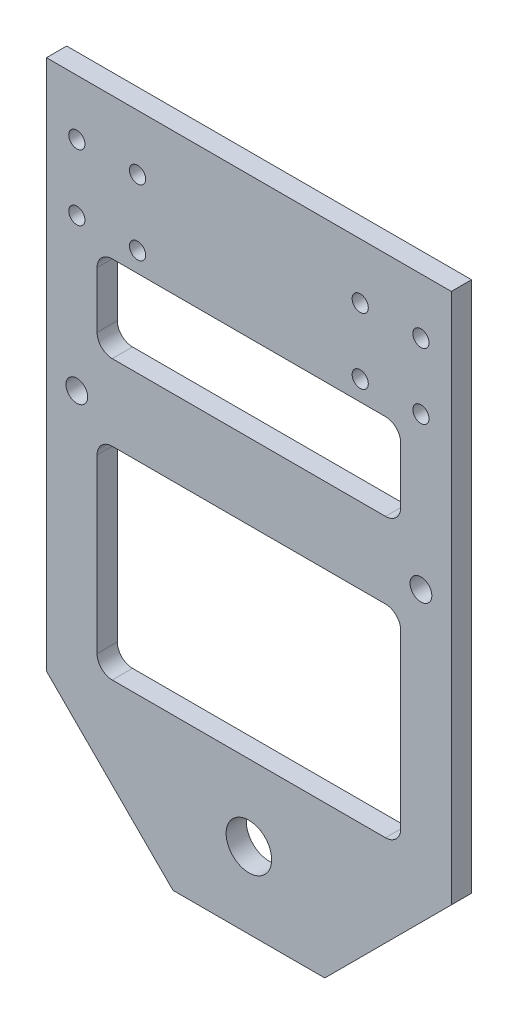
ISO-10303-21;
HEADER;
FILE_DESCRIPTION(('STEP AP214'),'2;1');
FILE_NAME('part.step','',(''),(''),'','','');
FILE_SCHEMA(('AUTOMOTIVE_DESIGN { 1 0 10303 214 1 1 1 1 }'));
ENDSEC;
DATA;
#1=APPLICATION_CONTEXT('core data for automotive mechanical design processes');
#2=APPLICATION_PROTOCOL_DEFINITION('international standard','automotive_design',2000,#1);
#3=PRODUCT_CONTEXT('',#1,'mechanical');
#4=PRODUCT('Part','Part','',(#3));
#5=PRODUCT_RELATED_PRODUCT_CATEGORY('part','',(#4));
#6=PRODUCT_DEFINITION_FORMATION('','',#4);
#7=PRODUCT_DEFINITION_CONTEXT('part definition',#1,'design');
#8=PRODUCT_DEFINITION('design','',#6,#7);
#9=PRODUCT_DEFINITION_SHAPE('','',#8);
#10=(LENGTH_UNIT() NAMED_UNIT(*) SI_UNIT(.MILLI.,.METRE.));
#11=(NAMED_UNIT(*) PLANE_ANGLE_UNIT() SI_UNIT($,.RADIAN.));
#12=(NAMED_UNIT(*) SI_UNIT($,.STERADIAN.) SOLID_ANGLE_UNIT());
#13=UNCERTAINTY_MEASURE_WITH_UNIT(LENGTH_MEASURE(1.E-05),#10,'distance_accuracy_value','');
#14=(GEOMETRIC_REPRESENTATION_CONTEXT(3) GLOBAL_UNCERTAINTY_ASSIGNED_CONTEXT((#13)) GLOBAL_UNIT_ASSIGNED_CONTEXT((#10,
#11,#12)) REPRESENTATION_CONTEXT('',''));
#15=CARTESIAN_POINT('',(0.,0.,0.));
#16=DIRECTION('',(0.,0.,1.));
#17=DIRECTION('',(1.,0.,0.));
#18=AXIS2_PLACEMENT_3D('',#15,#16,#17);
#19=CARTESIAN_POINT('',(0.,0.,-4.));
#20=DIRECTION('',(0.,0.,1.));
#21=DIRECTION('',(1.,0.,0.));
#22=AXIS2_PLACEMENT_3D('',#19,#20,#21);
#23=PLANE('',#22);
#24=CARTESIAN_POINT('',(-34.0000000000009,62.000000000002,-4.));
#25=DIRECTION('',(0.,0.,-1.));
#26=DIRECTION('',(-1.,0.,0.));
#27=AXIS2_PLACEMENT_3D('',#24,#25,#26);
#28=CIRCLE('',#27,1.5999999999986);
#29=CARTESIAN_POINT('',(-35.5999999999995,62.000000000002,-4.));
#30=VERTEX_POINT('',#29);
#31=EDGE_CURVE('E403',#30,#30,#28,.T.);
#32=ORIENTED_EDGE('',*,*,#31,.F.);
#33=EDGE_LOOP('',(#32));
#34=FACE_BOUND('',#33,.T.);
#35=CARTESIAN_POINT('',(34.,75.0000000000004,-4.));
#36=DIRECTION('',(0.,0.,-1.));
#37=DIRECTION('',(-1.,0.,0.));
#38=AXIS2_PLACEMENT_3D('',#35,#36,#37);
#39=CIRCLE('',#38,1.59999999992459);
#40=CARTESIAN_POINT('',(32.4000000000754,75.0000000000004,-4.));
#41=VERTEX_POINT('',#40);
#42=EDGE_CURVE('E410',#41,#41,#39,.T.);
#43=ORIENTED_EDGE('',*,*,#42,.F.);
#44=EDGE_LOOP('',(#43));
#45=FACE_BOUND('',#44,.T.);
#46=CARTESIAN_POINT('',(22.,75.0000000000004,-4.));
#47=DIRECTION('',(0.,0.,-1.));
#48=DIRECTION('',(-1.,0.,0.));
#49=AXIS2_PLACEMENT_3D('',#46,#47,#48);
#50=CIRCLE('',#49,1.59999999992459);
#51=CARTESIAN_POINT('',(20.4000000000754,75.0000000000004,-4.));
#52=VERTEX_POINT('',#51);
#53=EDGE_CURVE('E391',#52,#52,#50,.T.);
#54=ORIENTED_EDGE('',*,*,#53,.F.);
#55=EDGE_LOOP('',(#54));
#56=FACE_BOUND('',#55,.T.);
#57=CARTESIAN_POINT('',(-21.9999999999999,75.0000000000008,-4.));
#58=DIRECTION('',(0.,0.,-1.));
#59=DIRECTION('',(-1.,0.,0.));
#60=AXIS2_PLACEMENT_3D('',#57,#58,#59);
#61=CIRCLE('',#60,1.5999999999246);
#62=CARTESIAN_POINT('',(-23.5999999999245,75.0000000000008,-4.));
#63=VERTEX_POINT('',#62);
#64=EDGE_CURVE('E398',#63,#63,#61,.T.);
#65=ORIENTED_EDGE('',*,*,#64,.F.);
#66=EDGE_LOOP('',(#65));
#67=FACE_BOUND('',#66,.T.);
#68=CARTESIAN_POINT('',(-22.0000000000009,62.000000000002,-4.));
#69=DIRECTION('',(0.,0.,-1.));
#70=DIRECTION('',(-1.,0.,0.));
#71=AXIS2_PLACEMENT_3D('',#68,#69,#70);
#72=CIRCLE('',#71,1.59999999999762);
#73=CARTESIAN_POINT('',(-23.5999999999985,62.000000000002,-4.));
#74=VERTEX_POINT('',#73);
#75=EDGE_CURVE('E427',#74,#74,#72,.T.);
#76=ORIENTED_EDGE('',*,*,#75,.F.);
#77=EDGE_LOOP('',(#76));
#78=FACE_BOUND('',#77,.T.);
#79=CARTESIAN_POINT('',(21.9999999999999,62.0000000000022,-4.));
#80=DIRECTION('',(0.,0.,-1.));
#81=DIRECTION('',(-1.,0.,0.));
#82=AXIS2_PLACEMENT_3D('',#79,#80,#81);
#83=CIRCLE('',#82,1.60000000003217);
#84=CARTESIAN_POINT('',(20.3999999999678,62.0000000000022,-4.));
#85=VERTEX_POINT('',#84);
#86=EDGE_CURVE('E421',#85,#85,#83,.T.);
#87=ORIENTED_EDGE('',*,*,#86,.F.);
#88=EDGE_LOOP('',(#87));
#89=FACE_BOUND('',#88,.T.);
#90=CARTESIAN_POINT('',(33.9999999999999,62.0000000000022,-4.));
#91=DIRECTION('',(0.,0.,-1.));
#92=DIRECTION('',(-1.,0.,0.));
#93=AXIS2_PLACEMENT_3D('',#90,#91,#92);
#94=CIRCLE('',#93,1.60000000003218);
#95=CARTESIAN_POINT('',(32.3999999999678,62.0000000000022,-4.));
#96=VERTEX_POINT('',#95);
#97=EDGE_CURVE('E415',#96,#96,#94,.T.);
#98=ORIENTED_EDGE('',*,*,#97,.F.);
#99=EDGE_LOOP('',(#98));
#100=FACE_BOUND('',#99,.T.);
#101=CARTESIAN_POINT('',(-33.9999999999999,75.0000000000008,-4.));
#102=DIRECTION('',(0.,0.,-1.));
#103=DIRECTION('',(-1.,0.,0.));
#104=AXIS2_PLACEMENT_3D('',#101,#102,#103);
#105=CIRCLE('',#104,1.59999999992463);
#106=CARTESIAN_POINT('',(-35.5999999999245,75.0000000000008,-4.));
#107=VERTEX_POINT('',#106);
#108=EDGE_CURVE('E385',#107,#107,#105,.T.);
#109=ORIENTED_EDGE('',*,*,#108,.F.);
#110=EDGE_LOOP('',(#109));
#111=FACE_BOUND('',#110,.T.);
#112=CARTESIAN_POINT('',(34.,32.0000000000003,-4.));
#113=DIRECTION('',(0.,0.,-1.));
#114=DIRECTION('',(-1.,0.,0.));
#115=AXIS2_PLACEMENT_3D('',#112,#113,#114);
#116=CIRCLE('',#115,2.15);
#117=CARTESIAN_POINT('',(31.85,32.0000000000003,-4.));
#118=VERTEX_POINT('',#117);
#119=EDGE_CURVE('E380',#118,#118,#116,.T.);
#120=ORIENTED_EDGE('',*,*,#119,.F.);
#121=EDGE_LOOP('',(#120));
#122=FACE_BOUND('',#121,.T.);
#123=CARTESIAN_POINT('',(-34.,32.0000000000003,-4.));
#124=DIRECTION('',(0.,0.,-1.));
#125=DIRECTION('',(-1.,0.,0.));
#126=AXIS2_PLACEMENT_3D('',#123,#124,#125);
#127=CIRCLE('',#126,2.15);
#128=CARTESIAN_POINT('',(-36.15,32.0000000000003,-4.));
#129=VERTEX_POINT('',#128);
#130=EDGE_CURVE('E373',#129,#129,#127,.T.);
#131=ORIENTED_EDGE('',*,*,#130,.F.);
#132=EDGE_LOOP('',(#131));
#133=FACE_BOUND('',#132,.T.);
#134=DIRECTION('',(-1.,0.,0.));
#135=VECTOR('',#134,1.);
#136=CARTESIAN_POINT('',(0.,26.0000000000003,-4.));
#137=LINE('',#136,#135);
#138=CARTESIAN_POINT('',(27.,26.0000000000003,-4.));
#139=VERTEX_POINT('',#138);
#140=CARTESIAN_POINT('',(-27.,26.0000000000003,-4.));
#141=VERTEX_POINT('',#140);
#142=EDGE_CURVE('E59',#139,#141,#137,.T.);
#143=ORIENTED_EDGE('',*,*,#142,.T.);
#144=CARTESIAN_POINT('',(-27.,23.0000000000003,-4.));
#145=DIRECTION('',(0.,0.,-1.));
#146=DIRECTION('',(-1.,0.,0.));
#147=AXIS2_PLACEMENT_3D('',#144,#145,#146);
#148=CIRCLE('',#147,3.);
#149=CARTESIAN_POINT('',(-30.,23.0000000000003,-4.));
#150=VERTEX_POINT('',#149);
#151=EDGE_CURVE('E258',#141,#150,#148,.F.);
#152=ORIENTED_EDGE('',*,*,#151,.T.);
#153=DIRECTION('',(0.,-1.,0.));
#154=VECTOR('',#153,1.);
#155=CARTESIAN_POINT('',(-30.,0.,-4.));
#156=LINE('',#155,#154);
#157=CARTESIAN_POINT('',(-30.,-10.9999999999997,-4.));
#158=VERTEX_POINT('',#157);
#159=EDGE_CURVE('E255',#150,#158,#156,.T.);
#160=ORIENTED_EDGE('',*,*,#159,.T.);
#161=CARTESIAN_POINT('',(-27.,-10.9999999999997,-4.));
#162=DIRECTION('',(0.,0.,-1.));
#163=DIRECTION('',(-1.,0.,0.));
#164=AXIS2_PLACEMENT_3D('',#161,#162,#163);
#165=CIRCLE('',#164,3.);
#166=CARTESIAN_POINT('',(-27.,-13.9999999999997,-4.));
#167=VERTEX_POINT('',#166);
#168=EDGE_CURVE('E252',#167,#158,#165,.T.);
#169=ORIENTED_EDGE('',*,*,#168,.F.);
#170=DIRECTION('',(-1.,0.,0.));
#171=VECTOR('',#170,1.);
#172=CARTESIAN_POINT('',(0.,-13.9999999999997,-4.));
#173=LINE('',#172,#171);
#174=CARTESIAN_POINT('',(27.,-13.9999999999997,-4.));
#175=VERTEX_POINT('',#174);
#176=EDGE_CURVE('E249',#175,#167,#173,.T.);
#177=ORIENTED_EDGE('',*,*,#176,.F.);
#178=CARTESIAN_POINT('',(27.,-10.9999999999997,-4.));
#179=DIRECTION('',(0.,0.,-1.));
#180=DIRECTION('',(-1.,0.,0.));
#181=AXIS2_PLACEMENT_3D('',#178,#179,#180);
#182=CIRCLE('',#181,3.);
#183=CARTESIAN_POINT('',(30.,-10.9999999999997,-4.));
#184=VERTEX_POINT('',#183);
#185=EDGE_CURVE('E246',#184,#175,#182,.T.);
#186=ORIENTED_EDGE('',*,*,#185,.F.);
#187=DIRECTION('',(0.,-1.,0.));
#188=VECTOR('',#187,1.);
#189=CARTESIAN_POINT('',(30.,0.,-4.));
#190=LINE('',#189,#188);
#191=CARTESIAN_POINT('',(30.,23.0000000000003,-4.));
#192=VERTEX_POINT('',#191);
#193=EDGE_CURVE('E243',#192,#184,#190,.T.);
#194=ORIENTED_EDGE('',*,*,#193,.F.);
#195=CARTESIAN_POINT('',(27.,23.0000000000003,-4.));
#196=DIRECTION('',(0.,0.,-1.));
#197=DIRECTION('',(-1.,0.,0.));
#198=AXIS2_PLACEMENT_3D('',#195,#196,#197);
#199=CIRCLE('',#198,3.);
#200=EDGE_CURVE('E239',#139,#192,#199,.T.);
#201=ORIENTED_EDGE('',*,*,#200,.F.);
#202=EDGE_LOOP('',(#143,#152,#160,#169,#177,#186,#194,#201));
#203=FACE_BOUND('',#202,.T.);
#204=CARTESIAN_POINT('',(0.,-28.9999999999997,-4.));
#205=DIRECTION('',(0.,0.,1.));
#206=DIRECTION('',(1.,0.,0.));
#207=AXIS2_PLACEMENT_3D('',#204,#205,#206);
#208=CIRCLE('',#207,4.5);
#209=CARTESIAN_POINT('',(4.50000000000001,-28.9999999999997,-4.));
#210=VERTEX_POINT('',#209);
#211=EDGE_CURVE('E277',#210,#210,#208,.T.);
#212=ORIENTED_EDGE('',*,*,#211,.T.);
#213=EDGE_LOOP('',(#212));
#214=FACE_BOUND('',#213,.T.);
#215=DIRECTION('',(1.,0.,0.));
#216=VECTOR('',#215,1.);
#217=CARTESIAN_POINT('',(-40.,-43.9999999999997,-4.));
#218=LINE('',#217,#216);
#219=CARTESIAN_POINT('',(-14.9999999999999,-43.9999999999997,-4.));
#220=VERTEX_POINT('',#219);
#221=CARTESIAN_POINT('',(15.,-43.9999999999997,-4.));
#222=VERTEX_POINT('',#221);
#223=EDGE_CURVE('E286',#220,#222,#218,.T.);
#224=ORIENTED_EDGE('',*,*,#223,.F.);
#225=DIRECTION('',(0.707106781186549,-0.707106781186546,0.));
#226=VECTOR('',#225,1.);
#227=CARTESIAN_POINT('',(-40.,-18.9999999999997,-4.));
#228=LINE('',#227,#226);
#229=CARTESIAN_POINT('',(-40.,-18.9999999999997,-4.));
#230=VERTEX_POINT('',#229);
#231=EDGE_CURVE('E323',#220,#230,#228,.F.);
#232=ORIENTED_EDGE('',*,*,#231,.T.);
#233=DIRECTION('',(0.,-1.,0.));
#234=VECTOR('',#233,1.);
#235=CARTESIAN_POINT('',(-40.,86.0000000000003,-4.));
#236=LINE('',#235,#234);
#237=CARTESIAN_POINT('',(-40.,86.0000000000003,-4.));
#238=VERTEX_POINT('',#237);
#239=EDGE_CURVE('E283',#238,#230,#236,.T.);
#240=ORIENTED_EDGE('',*,*,#239,.F.);
#241=DIRECTION('',(-1.,0.,0.));
#242=VECTOR('',#241,1.);
#243=CARTESIAN_POINT('',(-40.,86.0000000000003,-4.));
#244=LINE('',#243,#242);
#245=CARTESIAN_POINT('',(40.,86.0000000000003,-4.));
#246=VERTEX_POINT('',#245);
#247=EDGE_CURVE('E292',#246,#238,#244,.T.);
#248=ORIENTED_EDGE('',*,*,#247,.F.);
#249=DIRECTION('',(0.,1.,0.));
#250=VECTOR('',#249,1.);
#251=CARTESIAN_POINT('',(40.,86.0000000000003,-4.));
#252=LINE('',#251,#250);
#253=CARTESIAN_POINT('',(40.,-18.9999999999996,-4.));
#254=VERTEX_POINT('',#253);
#255=EDGE_CURVE('E290',#254,#246,#252,.T.);
#256=ORIENTED_EDGE('',*,*,#255,.F.);
#257=DIRECTION('',(0.707106781186546,0.707106781186549,0.));
#258=VECTOR('',#257,1.);
#259=CARTESIAN_POINT('',(15.,-43.9999999999997,-4.));
#260=LINE('',#259,#258);
#261=EDGE_CURVE('E321',#254,#222,#260,.F.);
#262=ORIENTED_EDGE('',*,*,#261,.T.);
#263=EDGE_LOOP('',(#224,#232,#240,#248,#256,#262));
#264=FACE_BOUND('',#263,.T.);
#265=CARTESIAN_POINT('',(27.,55.0700000000003,-4.));
#266=DIRECTION('',(0.,0.,-1.));
#267=DIRECTION('',(-1.,0.,0.));
#268=AXIS2_PLACEMENT_3D('',#265,#266,#267);
#269=CIRCLE('',#268,3.);
#270=CARTESIAN_POINT('',(30.,55.0700000000003,-4.));
#271=VERTEX_POINT('',#270);
#272=CARTESIAN_POINT('',(27.,58.0700000000003,-4.));
#273=VERTEX_POINT('',#272);
#274=EDGE_CURVE('E51',#271,#273,#269,.F.);
#275=ORIENTED_EDGE('',*,*,#274,.T.);
#276=DIRECTION('',(-1.,0.,0.));
#277=VECTOR('',#276,1.);
#278=CARTESIAN_POINT('',(0.,58.0700000000003,-4.));
#279=LINE('',#278,#277);
#280=CARTESIAN_POINT('',(-27.,58.0700000000003,-4.));
#281=VERTEX_POINT('',#280);
#282=EDGE_CURVE('E222',#273,#281,#279,.T.);
#283=ORIENTED_EDGE('',*,*,#282,.T.);
#284=CARTESIAN_POINT('',(-27.,55.0700000000003,-4.));
#285=DIRECTION('',(0.,0.,-1.));
#286=DIRECTION('',(-1.,0.,0.));
#287=AXIS2_PLACEMENT_3D('',#284,#285,#286);
#288=CIRCLE('',#287,3.);
#289=CARTESIAN_POINT('',(-30.,55.0700000000003,-4.));
#290=VERTEX_POINT('',#289);
#291=EDGE_CURVE('E219',#290,#281,#288,.T.);
#292=ORIENTED_EDGE('',*,*,#291,.F.);
#293=DIRECTION('',(0.,-1.,0.));
#294=VECTOR('',#293,1.);
#295=CARTESIAN_POINT('',(-30.,0.,-4.));
#296=LINE('',#295,#294);
#297=CARTESIAN_POINT('',(-30.,44.0000000000003,-4.));
#298=VERTEX_POINT('',#297);
#299=EDGE_CURVE('E216',#290,#298,#296,.T.);
#300=ORIENTED_EDGE('',*,*,#299,.T.);
#301=CARTESIAN_POINT('',(-27.,44.0000000000003,-4.));
#302=DIRECTION('',(0.,0.,-1.));
#303=DIRECTION('',(-1.,0.,0.));
#304=AXIS2_PLACEMENT_3D('',#301,#302,#303);
#305=CIRCLE('',#304,3.);
#306=CARTESIAN_POINT('',(-27.,41.0000000000003,-4.));
#307=VERTEX_POINT('',#306);
#308=EDGE_CURVE('E210',#307,#298,#305,.T.);
#309=ORIENTED_EDGE('',*,*,#308,.F.);
#310=DIRECTION('',(-1.,0.,0.));
#311=VECTOR('',#310,1.);
#312=CARTESIAN_POINT('',(0.,41.0000000000003,-4.));
#313=LINE('',#312,#311);
#314=CARTESIAN_POINT('',(27.,41.0000000000003,-4.));
#315=VERTEX_POINT('',#314);
#316=EDGE_CURVE('E208',#315,#307,#313,.T.);
#317=ORIENTED_EDGE('',*,*,#316,.F.);
#318=CARTESIAN_POINT('',(27.,44.0000000000003,-4.));
#319=DIRECTION('',(0.,0.,-1.));
#320=DIRECTION('',(-1.,0.,0.));
#321=AXIS2_PLACEMENT_3D('',#318,#319,#320);
#322=CIRCLE('',#321,3.);
#323=CARTESIAN_POINT('',(30.,44.0000000000003,-4.));
#324=VERTEX_POINT('',#323);
#325=EDGE_CURVE('E192',#324,#315,#322,.T.);
#326=ORIENTED_EDGE('',*,*,#325,.F.);
#327=DIRECTION('',(0.,-1.,0.));
#328=VECTOR('',#327,1.);
#329=CARTESIAN_POINT('',(30.,0.,-4.));
#330=LINE('',#329,#328);
#331=EDGE_CURVE('E202',#271,#324,#330,.T.);
#332=ORIENTED_EDGE('',*,*,#331,.F.);
#333=EDGE_LOOP('',(#275,#283,#292,#300,#309,#317,#326,#332));
#334=FACE_BOUND('',#333,.T.);
#335=ADVANCED_FACE('F36',(#34,#45,#56,#67,#78,#89,#100,#111,#122,#133,#203,#214,#264,#334),#23,.F.);
#336=CARTESIAN_POINT('',(0.,0.,0.));
#337=DIRECTION('',(0.,0.,1.));
#338=DIRECTION('',(1.,0.,0.));
#339=AXIS2_PLACEMENT_3D('',#336,#337,#338);
#340=PLANE('',#339);
#341=CARTESIAN_POINT('',(-34.0000000000009,62.000000000002,0.));
#342=DIRECTION('',(0.,0.,-1.));
#343=DIRECTION('',(-1.,0.,0.));
#344=AXIS2_PLACEMENT_3D('',#341,#342,#343);
#345=CIRCLE('',#344,1.5999999999986);
#346=CARTESIAN_POINT('',(-35.5999999999995,62.000000000002,0.));
#347=VERTEX_POINT('',#346);
#348=EDGE_CURVE('E406',#347,#347,#345,.T.);
#349=ORIENTED_EDGE('',*,*,#348,.T.);
#350=EDGE_LOOP('',(#349));
#351=FACE_BOUND('',#350,.T.);
#352=CARTESIAN_POINT('',(34.,75.0000000000004,0.));
#353=DIRECTION('',(0.,0.,-1.));
#354=DIRECTION('',(-1.,0.,0.));
#355=AXIS2_PLACEMENT_3D('',#352,#353,#354);
#356=CIRCLE('',#355,1.59999999992459);
#357=CARTESIAN_POINT('',(32.4000000000754,75.0000000000004,0.));
#358=VERTEX_POINT('',#357);
#359=EDGE_CURVE('E395',#358,#358,#356,.T.);
#360=ORIENTED_EDGE('',*,*,#359,.T.);
#361=EDGE_LOOP('',(#360));
#362=FACE_BOUND('',#361,.T.);
#363=CARTESIAN_POINT('',(22.,75.0000000000004,0.));
#364=DIRECTION('',(0.,0.,-1.));
#365=DIRECTION('',(-1.,0.,0.));
#366=AXIS2_PLACEMENT_3D('',#363,#364,#365);
#367=CIRCLE('',#366,1.59999999992459);
#368=CARTESIAN_POINT('',(20.4000000000754,75.0000000000004,0.));
#369=VERTEX_POINT('',#368);
#370=EDGE_CURVE('E394',#369,#369,#367,.T.);
#371=ORIENTED_EDGE('',*,*,#370,.T.);
#372=EDGE_LOOP('',(#371));
#373=FACE_BOUND('',#372,.T.);
#374=CARTESIAN_POINT('',(-21.9999999999999,75.0000000000008,0.));
#375=DIRECTION('',(0.,0.,-1.));
#376=DIRECTION('',(-1.,0.,0.));
#377=AXIS2_PLACEMENT_3D('',#374,#375,#376);
#378=CIRCLE('',#377,1.5999999999246);
#379=CARTESIAN_POINT('',(-23.5999999999245,75.0000000000008,0.));
#380=VERTEX_POINT('',#379);
#381=EDGE_CURVE('E388',#380,#380,#378,.T.);
#382=ORIENTED_EDGE('',*,*,#381,.T.);
#383=EDGE_LOOP('',(#382));
#384=FACE_BOUND('',#383,.T.);
#385=CARTESIAN_POINT('',(-22.0000000000009,62.000000000002,0.));
#386=DIRECTION('',(0.,0.,-1.));
#387=DIRECTION('',(-1.,0.,0.));
#388=AXIS2_PLACEMENT_3D('',#385,#386,#387);
#389=CIRCLE('',#388,1.59999999999762);
#390=CARTESIAN_POINT('',(-23.5999999999985,62.000000000002,0.));
#391=VERTEX_POINT('',#390);
#392=EDGE_CURVE('E407',#391,#391,#389,.T.);
#393=ORIENTED_EDGE('',*,*,#392,.T.);
#394=EDGE_LOOP('',(#393));
#395=FACE_BOUND('',#394,.T.);
#396=CARTESIAN_POINT('',(21.9999999999999,62.0000000000022,0.));
#397=DIRECTION('',(0.,0.,-1.));
#398=DIRECTION('',(-1.,0.,0.));
#399=AXIS2_PLACEMENT_3D('',#396,#397,#398);
#400=CIRCLE('',#399,1.60000000003217);
#401=CARTESIAN_POINT('',(20.3999999999678,62.0000000000022,0.));
#402=VERTEX_POINT('',#401);
#403=EDGE_CURVE('E424',#402,#402,#400,.T.);
#404=ORIENTED_EDGE('',*,*,#403,.T.);
#405=EDGE_LOOP('',(#404));
#406=FACE_BOUND('',#405,.T.);
#407=CARTESIAN_POINT('',(33.9999999999999,62.0000000000022,0.));
#408=DIRECTION('',(0.,0.,-1.));
#409=DIRECTION('',(-1.,0.,0.));
#410=AXIS2_PLACEMENT_3D('',#407,#408,#409);
#411=CIRCLE('',#410,1.60000000003218);
#412=CARTESIAN_POINT('',(32.3999999999678,62.0000000000022,0.));
#413=VERTEX_POINT('',#412);
#414=EDGE_CURVE('E418',#413,#413,#411,.T.);
#415=ORIENTED_EDGE('',*,*,#414,.T.);
#416=EDGE_LOOP('',(#415));
#417=FACE_BOUND('',#416,.T.);
#418=CARTESIAN_POINT('',(-33.9999999999999,75.0000000000008,0.));
#419=DIRECTION('',(0.,0.,-1.));
#420=DIRECTION('',(-1.,0.,0.));
#421=AXIS2_PLACEMENT_3D('',#418,#419,#420);
#422=CIRCLE('',#421,1.59999999992463);
#423=CARTESIAN_POINT('',(-35.5999999999245,75.0000000000008,0.));
#424=VERTEX_POINT('',#423);
#425=EDGE_CURVE('E377',#424,#424,#422,.T.);
#426=ORIENTED_EDGE('',*,*,#425,.T.);
#427=EDGE_LOOP('',(#426));
#428=FACE_BOUND('',#427,.T.);
#429=CARTESIAN_POINT('',(34.,32.0000000000003,0.));
#430=DIRECTION('',(0.,0.,-1.));
#431=DIRECTION('',(-1.,0.,0.));
#432=AXIS2_PLACEMENT_3D('',#429,#430,#431);
#433=CIRCLE('',#432,2.15);
#434=CARTESIAN_POINT('',(31.85,32.0000000000003,0.));
#435=VERTEX_POINT('',#434);
#436=EDGE_CURVE('E240',#435,#435,#433,.T.);
#437=ORIENTED_EDGE('',*,*,#436,.T.);
#438=EDGE_LOOP('',(#437));
#439=FACE_BOUND('',#438,.T.);
#440=CARTESIAN_POINT('',(-34.,32.0000000000003,0.));
#441=DIRECTION('',(0.,0.,-1.));
#442=DIRECTION('',(-1.,0.,0.));
#443=AXIS2_PLACEMENT_3D('',#440,#441,#442);
#444=CIRCLE('',#443,2.15);
#445=CARTESIAN_POINT('',(-36.15,32.0000000000003,0.));
#446=VERTEX_POINT('',#445);
#447=EDGE_CURVE('E376',#446,#446,#444,.T.);
#448=ORIENTED_EDGE('',*,*,#447,.T.);
#449=EDGE_LOOP('',(#448));
#450=FACE_BOUND('',#449,.T.);
#451=CARTESIAN_POINT('',(0.,-28.9999999999997,0.));
#452=DIRECTION('',(0.,0.,1.));
#453=DIRECTION('',(1.,0.,0.));
#454=AXIS2_PLACEMENT_3D('',#451,#452,#453);
#455=CIRCLE('',#454,4.5);
#456=CARTESIAN_POINT('',(4.50000000000001,-28.9999999999997,0.));
#457=VERTEX_POINT('',#456);
#458=EDGE_CURVE('E227',#457,#457,#455,.T.);
#459=ORIENTED_EDGE('',*,*,#458,.F.);
#460=EDGE_LOOP('',(#459));
#461=FACE_BOUND('',#460,.T.);
#462=DIRECTION('',(0.,-1.,0.));
#463=VECTOR('',#462,1.);
#464=CARTESIAN_POINT('',(-40.,86.0000000000003,0.));
#465=LINE('',#464,#463);
#466=CARTESIAN_POINT('',(-40.,86.0000000000003,0.));
#467=VERTEX_POINT('',#466);
#468=CARTESIAN_POINT('',(-40.,-18.9999999999997,0.));
#469=VERTEX_POINT('',#468);
#470=EDGE_CURVE('E280',#467,#469,#465,.T.);
#471=ORIENTED_EDGE('',*,*,#470,.T.);
#472=DIRECTION('',(-0.707106781186549,0.707106781186546,0.));
#473=VECTOR('',#472,1.);
#474=CARTESIAN_POINT('',(-29.4999999999998,-29.4999999999999,0.));
#475=LINE('',#474,#473);
#476=CARTESIAN_POINT('',(-14.9999999999999,-43.9999999999997,0.));
#477=VERTEX_POINT('',#476);
#478=EDGE_CURVE('E314',#469,#477,#475,.F.);
#479=ORIENTED_EDGE('',*,*,#478,.T.);
#480=DIRECTION('',(1.,0.,0.));
#481=VECTOR('',#480,1.);
#482=CARTESIAN_POINT('',(-40.,-43.9999999999997,0.));
#483=LINE('',#482,#481);
#484=CARTESIAN_POINT('',(15.,-43.9999999999997,0.));
#485=VERTEX_POINT('',#484);
#486=EDGE_CURVE('E298',#477,#485,#483,.T.);
#487=ORIENTED_EDGE('',*,*,#486,.T.);
#488=DIRECTION('',(-0.707106781186546,-0.707106781186549,0.));
#489=VECTOR('',#488,1.);
#490=CARTESIAN_POINT('',(29.4999999999999,-29.4999999999998,0.));
#491=LINE('',#490,#489);
#492=CARTESIAN_POINT('',(40.,-18.9999999999996,0.));
#493=VERTEX_POINT('',#492);
#494=EDGE_CURVE('E312',#485,#493,#491,.F.);
#495=ORIENTED_EDGE('',*,*,#494,.T.);
#496=DIRECTION('',(0.,1.,0.));
#497=VECTOR('',#496,1.);
#498=CARTESIAN_POINT('',(40.,86.0000000000003,0.));
#499=LINE('',#498,#497);
#500=CARTESIAN_POINT('',(40.,86.0000000000003,0.));
#501=VERTEX_POINT('',#500);
#502=EDGE_CURVE('E301',#493,#501,#499,.T.);
#503=ORIENTED_EDGE('',*,*,#502,.T.);
#504=DIRECTION('',(-1.,0.,0.));
#505=VECTOR('',#504,1.);
#506=CARTESIAN_POINT('',(-40.,86.0000000000003,0.));
#507=LINE('',#506,#505);
#508=EDGE_CURVE('E287',#501,#467,#507,.T.);
#509=ORIENTED_EDGE('',*,*,#508,.T.);
#510=EDGE_LOOP('',(#471,#479,#487,#495,#503,#509));
#511=FACE_BOUND('',#510,.T.);
#512=CARTESIAN_POINT('',(-27.,23.0000000000003,0.));
#513=DIRECTION('',(0.,0.,1.));
#514=DIRECTION('',(1.,0.,0.));
#515=AXIS2_PLACEMENT_3D('',#512,#513,#514);
#516=CIRCLE('',#515,3.);
#517=CARTESIAN_POINT('',(-30.,23.0000000000003,0.));
#518=VERTEX_POINT('',#517);
#519=CARTESIAN_POINT('',(-27.,26.0000000000003,0.));
#520=VERTEX_POINT('',#519);
#521=EDGE_CURVE('E341',#518,#520,#516,.F.);
#522=ORIENTED_EDGE('',*,*,#521,.T.);
#523=DIRECTION('',(1.,0.,0.));
#524=VECTOR('',#523,1.);
#525=CARTESIAN_POINT('',(0.,26.0000000000003,0.));
#526=LINE('',#525,#524);
#527=CARTESIAN_POINT('',(27.,26.0000000000003,0.));
#528=VERTEX_POINT('',#527);
#529=EDGE_CURVE('E344',#520,#528,#526,.T.);
#530=ORIENTED_EDGE('',*,*,#529,.T.);
#531=CARTESIAN_POINT('',(27.,23.0000000000003,0.));
#532=DIRECTION('',(0.,0.,1.));
#533=DIRECTION('',(1.,0.,0.));
#534=AXIS2_PLACEMENT_3D('',#531,#532,#533);
#535=CIRCLE('',#534,3.);
#536=CARTESIAN_POINT('',(30.,23.0000000000003,0.));
#537=VERTEX_POINT('',#536);
#538=EDGE_CURVE('E327',#537,#528,#535,.T.);
#539=ORIENTED_EDGE('',*,*,#538,.F.);
#540=DIRECTION('',(0.,1.,0.));
#541=VECTOR('',#540,1.);
#542=CARTESIAN_POINT('',(30.,0.,0.));
#543=LINE('',#542,#541);
#544=CARTESIAN_POINT('',(30.,-10.9999999999997,0.));
#545=VERTEX_POINT('',#544);
#546=EDGE_CURVE('E329',#545,#537,#543,.T.);
#547=ORIENTED_EDGE('',*,*,#546,.F.);
#548=CARTESIAN_POINT('',(27.,-10.9999999999997,0.));
#549=DIRECTION('',(0.,0.,1.));
#550=DIRECTION('',(1.,0.,0.));
#551=AXIS2_PLACEMENT_3D('',#548,#549,#550);
#552=CIRCLE('',#551,3.);
#553=CARTESIAN_POINT('',(27.,-13.9999999999997,0.));
#554=VERTEX_POINT('',#553);
#555=EDGE_CURVE('E332',#554,#545,#552,.T.);
#556=ORIENTED_EDGE('',*,*,#555,.F.);
#557=DIRECTION('',(1.,0.,0.));
#558=VECTOR('',#557,1.);
#559=CARTESIAN_POINT('',(0.,-13.9999999999997,0.));
#560=LINE('',#559,#558);
#561=CARTESIAN_POINT('',(-27.,-13.9999999999997,0.));
#562=VERTEX_POINT('',#561);
#563=EDGE_CURVE('E334',#562,#554,#560,.T.);
#564=ORIENTED_EDGE('',*,*,#563,.F.);
#565=CARTESIAN_POINT('',(-27.,-10.9999999999997,0.));
#566=DIRECTION('',(0.,0.,1.));
#567=DIRECTION('',(1.,0.,0.));
#568=AXIS2_PLACEMENT_3D('',#565,#566,#567);
#569=CIRCLE('',#568,3.);
#570=CARTESIAN_POINT('',(-30.,-10.9999999999997,0.));
#571=VERTEX_POINT('',#570);
#572=EDGE_CURVE('E336',#571,#562,#569,.T.);
#573=ORIENTED_EDGE('',*,*,#572,.F.);
#574=DIRECTION('',(0.,1.,0.));
#575=VECTOR('',#574,1.);
#576=CARTESIAN_POINT('',(-30.,0.,0.));
#577=LINE('',#576,#575);
#578=EDGE_CURVE('E338',#571,#518,#577,.T.);
#579=ORIENTED_EDGE('',*,*,#578,.T.);
#580=EDGE_LOOP('',(#522,#530,#539,#547,#556,#564,#573,#579));
#581=FACE_BOUND('',#580,.T.);
#582=DIRECTION('',(1.,0.,0.));
#583=VECTOR('',#582,1.);
#584=CARTESIAN_POINT('',(0.,58.0700000000003,0.));
#585=LINE('',#584,#583);
#586=CARTESIAN_POINT('',(-27.,58.0700000000003,0.));
#587=VERTEX_POINT('',#586);
#588=CARTESIAN_POINT('',(27.,58.0700000000003,0.));
#589=VERTEX_POINT('',#588);
#590=EDGE_CURVE('E44',#587,#589,#585,.T.);
#591=ORIENTED_EDGE('',*,*,#590,.T.);
#592=CARTESIAN_POINT('',(27.,55.0700000000003,0.));
#593=DIRECTION('',(0.,0.,1.));
#594=DIRECTION('',(1.,0.,0.));
#595=AXIS2_PLACEMENT_3D('',#592,#593,#594);
#596=CIRCLE('',#595,3.);
#597=CARTESIAN_POINT('',(30.,55.0700000000003,0.));
#598=VERTEX_POINT('',#597);
#599=EDGE_CURVE('E12',#589,#598,#596,.F.);
#600=ORIENTED_EDGE('',*,*,#599,.T.);
#601=DIRECTION('',(0.,1.,0.));
#602=VECTOR('',#601,1.);
#603=CARTESIAN_POINT('',(30.,0.,0.));
#604=LINE('',#603,#602);
#605=CARTESIAN_POINT('',(30.,44.0000000000003,0.));
#606=VERTEX_POINT('',#605);
#607=EDGE_CURVE('E347',#606,#598,#604,.T.);
#608=ORIENTED_EDGE('',*,*,#607,.F.);
#609=CARTESIAN_POINT('',(27.,44.0000000000003,0.));
#610=DIRECTION('',(0.,0.,1.));
#611=DIRECTION('',(1.,0.,0.));
#612=AXIS2_PLACEMENT_3D('',#609,#610,#611);
#613=CIRCLE('',#612,3.);
#614=CARTESIAN_POINT('',(27.,41.0000000000003,0.));
#615=VERTEX_POINT('',#614);
#616=EDGE_CURVE('E195',#615,#606,#613,.T.);
#617=ORIENTED_EDGE('',*,*,#616,.F.);
#618=DIRECTION('',(1.,0.,0.));
#619=VECTOR('',#618,1.);
#620=CARTESIAN_POINT('',(0.,41.0000000000003,0.));
#621=LINE('',#620,#619);
#622=CARTESIAN_POINT('',(-27.,41.0000000000003,0.));
#623=VERTEX_POINT('',#622);
#624=EDGE_CURVE('E350',#623,#615,#621,.T.);
#625=ORIENTED_EDGE('',*,*,#624,.F.);
#626=CARTESIAN_POINT('',(-27.,44.0000000000003,0.));
#627=DIRECTION('',(0.,0.,1.));
#628=DIRECTION('',(1.,0.,0.));
#629=AXIS2_PLACEMENT_3D('',#626,#627,#628);
#630=CIRCLE('',#629,3.);
#631=CARTESIAN_POINT('',(-30.,44.0000000000003,0.));
#632=VERTEX_POINT('',#631);
#633=EDGE_CURVE('E352',#632,#623,#630,.T.);
#634=ORIENTED_EDGE('',*,*,#633,.F.);
#635=DIRECTION('',(0.,1.,0.));
#636=VECTOR('',#635,1.);
#637=CARTESIAN_POINT('',(-30.,0.,0.));
#638=LINE('',#637,#636);
#639=CARTESIAN_POINT('',(-30.,55.0700000000003,0.));
#640=VERTEX_POINT('',#639);
#641=EDGE_CURVE('E354',#632,#640,#638,.T.);
#642=ORIENTED_EDGE('',*,*,#641,.T.);
#643=CARTESIAN_POINT('',(-27.,55.0700000000003,0.));
#644=DIRECTION('',(0.,0.,1.));
#645=DIRECTION('',(1.,0.,0.));
#646=AXIS2_PLACEMENT_3D('',#643,#644,#645);
#647=CIRCLE('',#646,3.);
#648=EDGE_CURVE('E357',#587,#640,#647,.T.);
#649=ORIENTED_EDGE('',*,*,#648,.F.);
#650=EDGE_LOOP('',(#591,#600,#608,#617,#625,#634,#642,#649));
#651=FACE_BOUND('',#650,.T.);
#652=ADVANCED_FACE('F361',(#351,#362,#373,#384,#395,#406,#417,#428,#439,#450,#461,#511,#581,
#651),#340,.T.);
#653=CARTESIAN_POINT('',(-40.,86.0000000000003,-4.));
#654=DIRECTION('',(-1.,0.,0.));
#655=DIRECTION('',(0.,-1.,0.));
#656=AXIS2_PLACEMENT_3D('',#653,#654,#655);
#657=PLANE('',#656);
#658=ORIENTED_EDGE('',*,*,#239,.T.);
#659=DIRECTION('',(0.,0.,1.));
#660=VECTOR('',#659,1.);
#661=CARTESIAN_POINT('',(-40.,-18.9999999999997,-4.));
#662=LINE('',#661,#660);
#663=EDGE_CURVE('E307',#230,#469,#662,.T.);
#664=ORIENTED_EDGE('',*,*,#663,.T.);
#665=ORIENTED_EDGE('',*,*,#470,.F.);
#666=DIRECTION('',(0.,0.,1.));
#667=VECTOR('',#666,1.);
#668=CARTESIAN_POINT('',(-40.,86.0000000000003,-4.));
#669=LINE('',#668,#667);
#670=EDGE_CURVE('E305',#238,#467,#669,.T.);
#671=ORIENTED_EDGE('',*,*,#670,.F.);
#672=EDGE_LOOP('',(#658,#664,#665,#671));
#673=FACE_BOUND('',#672,.T.);
#674=ADVANCED_FACE('F474',(#673),#657,.T.);
#675=CARTESIAN_POINT('',(-40.,86.0000000000003,-4.));
#676=DIRECTION('',(0.,1.,0.));
#677=DIRECTION('',(0.,0.,1.));
#678=AXIS2_PLACEMENT_3D('',#675,#676,#677);
#679=PLANE('',#678);
#680=ORIENTED_EDGE('',*,*,#508,.F.);
#681=DIRECTION('',(0.,0.,1.));
#682=VECTOR('',#681,1.);
#683=CARTESIAN_POINT('',(40.,86.0000000000003,-4.));
#684=LINE('',#683,#682);
#685=EDGE_CURVE('E295',#246,#501,#684,.T.);
#686=ORIENTED_EDGE('',*,*,#685,.F.);
#687=ORIENTED_EDGE('',*,*,#247,.T.);
#688=ORIENTED_EDGE('',*,*,#670,.T.);
#689=EDGE_LOOP('',(#680,#686,#687,#688));
#690=FACE_BOUND('',#689,.T.);
#691=ADVANCED_FACE('F482',(#690),#679,.T.);
#692=CARTESIAN_POINT('',(40.,86.0000000000003,-4.));
#693=DIRECTION('',(1.,0.,0.));
#694=DIRECTION('',(0.,1.,0.));
#695=AXIS2_PLACEMENT_3D('',#692,#693,#694);
#696=PLANE('',#695);
#697=ORIENTED_EDGE('',*,*,#502,.F.);
#698=DIRECTION('',(0.,0.,-1.));
#699=VECTOR('',#698,1.);
#700=CARTESIAN_POINT('',(40.,-18.9999999999996,-4.));
#701=LINE('',#700,#699);
#702=EDGE_CURVE('E325',#493,#254,#701,.T.);
#703=ORIENTED_EDGE('',*,*,#702,.T.);
#704=ORIENTED_EDGE('',*,*,#255,.T.);
#705=ORIENTED_EDGE('',*,*,#685,.T.);
#706=EDGE_LOOP('',(#697,#703,#704,#705));
#707=FACE_BOUND('',#706,.T.);
#708=ADVANCED_FACE('F488',(#707),#696,.T.);
#709=CARTESIAN_POINT('',(-40.,-43.9999999999997,-4.));
#710=DIRECTION('',(0.,-1.,0.));
#711=DIRECTION('',(0.,0.,-1.));
#712=AXIS2_PLACEMENT_3D('',#709,#710,#711);
#713=PLANE('',#712);
#714=ORIENTED_EDGE('',*,*,#486,.F.);
#715=DIRECTION('',(0.,0.,-1.));
#716=VECTOR('',#715,1.);
#717=CARTESIAN_POINT('',(-14.9999999999999,-43.9999999999997,-4.));
#718=LINE('',#717,#716);
#719=EDGE_CURVE('E319',#477,#220,#718,.T.);
#720=ORIENTED_EDGE('',*,*,#719,.T.);
#721=ORIENTED_EDGE('',*,*,#223,.T.);
#722=DIRECTION('',(0.,0.,1.));
#723=VECTOR('',#722,1.);
#724=CARTESIAN_POINT('',(15.,-43.9999999999997,-4.));
#725=LINE('',#724,#723);
#726=EDGE_CURVE('E316',#222,#485,#725,.T.);
#727=ORIENTED_EDGE('',*,*,#726,.T.);
#728=EDGE_LOOP('',(#714,#720,#721,#727));
#729=FACE_BOUND('',#728,.T.);
#730=ADVANCED_FACE('F487',(#729),#713,.T.);
#731=CARTESIAN_POINT('',(0.,-28.9999999999997,-4.));
#732=DIRECTION('',(0.,0.,1.));
#733=DIRECTION('',(1.,0.,0.));
#734=AXIS2_PLACEMENT_3D('',#731,#732,#733);
#735=CYLINDRICAL_SURFACE('',#734,4.5);
#736=ORIENTED_EDGE('',*,*,#211,.F.);
#737=EDGE_LOOP('',(#736));
#738=FACE_BOUND('',#737,.T.);
#739=ORIENTED_EDGE('',*,*,#458,.T.);
#740=EDGE_LOOP('',(#739));
#741=FACE_BOUND('',#740,.T.);
#742=ADVANCED_FACE('F495',(#738,#741),#735,.F.);
#743=CARTESIAN_POINT('',(-40.,-18.9999999999997,-4.));
#744=DIRECTION('',(0.707106781186546,0.707106781186549,0.));
#745=DIRECTION('',(0.,0.,1.));
#746=AXIS2_PLACEMENT_3D('',#743,#744,#745);
#747=PLANE('',#746);
#748=ORIENTED_EDGE('',*,*,#231,.F.);
#749=ORIENTED_EDGE('',*,*,#719,.F.);
#750=ORIENTED_EDGE('',*,*,#478,.F.);
#751=ORIENTED_EDGE('',*,*,#663,.F.);
#752=EDGE_LOOP('',(#748,#749,#750,#751));
#753=FACE_BOUND('',#752,.T.);
#754=ADVANCED_FACE('F471',(#753),#747,.F.);
#755=CARTESIAN_POINT('',(15.,-43.9999999999997,-4.));
#756=DIRECTION('',(-0.707106781186549,0.707106781186546,0.));
#757=DIRECTION('',(0.,0.,1.));
#758=AXIS2_PLACEMENT_3D('',#755,#756,#757);
#759=PLANE('',#758);
#760=ORIENTED_EDGE('',*,*,#261,.F.);
#761=ORIENTED_EDGE('',*,*,#702,.F.);
#762=ORIENTED_EDGE('',*,*,#494,.F.);
#763=ORIENTED_EDGE('',*,*,#726,.F.);
#764=EDGE_LOOP('',(#760,#761,#762,#763));
#765=FACE_BOUND('',#764,.T.);
#766=ADVANCED_FACE('F38',(#765),#759,.F.);
#767=CARTESIAN_POINT('',(0.,26.0000000000003,1.));
#768=DIRECTION('',(0.,-1.,0.));
#769=DIRECTION('',(1.,0.,0.));
#770=AXIS2_PLACEMENT_3D('',#767,#768,#769);
#771=PLANE('',#770);
#772=DIRECTION('',(0.,0.,-1.));
#773=VECTOR('',#772,1.);
#774=CARTESIAN_POINT('',(-27.,26.0000000000003,1.));
#775=LINE('',#774,#773);
#776=EDGE_CURVE('E262',#520,#141,#775,.T.);
#777=ORIENTED_EDGE('',*,*,#776,.T.);
#778=ORIENTED_EDGE('',*,*,#142,.F.);
#779=DIRECTION('',(0.,0.,-1.));
#780=VECTOR('',#779,1.);
#781=CARTESIAN_POINT('',(27.,26.0000000000003,1.));
#782=LINE('',#781,#780);
#783=EDGE_CURVE('E261',#528,#139,#782,.T.);
#784=ORIENTED_EDGE('',*,*,#783,.F.);
#785=ORIENTED_EDGE('',*,*,#529,.F.);
#786=EDGE_LOOP('',(#777,#778,#784,#785));
#787=FACE_BOUND('',#786,.T.);
#788=ADVANCED_FACE('F506',(#787),#771,.T.);
#789=CARTESIAN_POINT('',(-27.,23.0000000000003,1.));
#790=DIRECTION('',(0.,0.,-1.));
#791=DIRECTION('',(-1.,0.,0.));
#792=AXIS2_PLACEMENT_3D('',#789,#790,#791);
#793=CYLINDRICAL_SURFACE('',#792,3.);
#794=DIRECTION('',(0.,0.,-1.));
#795=VECTOR('',#794,1.);
#796=CARTESIAN_POINT('',(-30.,23.0000000000003,1.));
#797=LINE('',#796,#795);
#798=EDGE_CURVE('E264',#518,#150,#797,.T.);
#799=ORIENTED_EDGE('',*,*,#798,.T.);
#800=ORIENTED_EDGE('',*,*,#151,.F.);
#801=ORIENTED_EDGE('',*,*,#776,.F.);
#802=ORIENTED_EDGE('',*,*,#521,.F.);
#803=EDGE_LOOP('',(#799,#800,#801,#802));
#804=FACE_BOUND('',#803,.T.);
#805=ADVANCED_FACE('F579',(#804),#793,.F.);
#806=CARTESIAN_POINT('',(-30.,0.,1.));
#807=DIRECTION('',(1.,0.,0.));
#808=DIRECTION('',(0.,1.,0.));
#809=AXIS2_PLACEMENT_3D('',#806,#807,#808);
#810=PLANE('',#809);
#811=DIRECTION('',(0.,0.,-1.));
#812=VECTOR('',#811,1.);
#813=CARTESIAN_POINT('',(-30.,-10.9999999999997,1.));
#814=LINE('',#813,#812);
#815=EDGE_CURVE('E266',#571,#158,#814,.T.);
#816=ORIENTED_EDGE('',*,*,#815,.T.);
#817=ORIENTED_EDGE('',*,*,#159,.F.);
#818=ORIENTED_EDGE('',*,*,#798,.F.);
#819=ORIENTED_EDGE('',*,*,#578,.F.);
#820=EDGE_LOOP('',(#816,#817,#818,#819));
#821=FACE_BOUND('',#820,.T.);
#822=ADVANCED_FACE('F582',(#821),#810,.T.);
#823=CARTESIAN_POINT('',(-27.,-10.9999999999997,1.));
#824=DIRECTION('',(0.,0.,-1.));
#825=DIRECTION('',(-1.,0.,0.));
#826=AXIS2_PLACEMENT_3D('',#823,#824,#825);
#827=CYLINDRICAL_SURFACE('',#826,3.);
#828=ORIENTED_EDGE('',*,*,#572,.T.);
#829=DIRECTION('',(0.,0.,-1.));
#830=VECTOR('',#829,1.);
#831=CARTESIAN_POINT('',(-27.,-13.9999999999997,1.));
#832=LINE('',#831,#830);
#833=EDGE_CURVE('E268',#562,#167,#832,.T.);
#834=ORIENTED_EDGE('',*,*,#833,.T.);
#835=ORIENTED_EDGE('',*,*,#168,.T.);
#836=ORIENTED_EDGE('',*,*,#815,.F.);
#837=EDGE_LOOP('',(#828,#834,#835,#836));
#838=FACE_BOUND('',#837,.T.);
#839=ADVANCED_FACE('F586',(#838),#827,.F.);
#840=CARTESIAN_POINT('',(0.,-13.9999999999997,1.));
#841=DIRECTION('',(0.,-1.,0.));
#842=DIRECTION('',(0.,0.,-1.));
#843=AXIS2_PLACEMENT_3D('',#840,#841,#842);
#844=PLANE('',#843);
#845=ORIENTED_EDGE('',*,*,#563,.T.);
#846=DIRECTION('',(0.,0.,-1.));
#847=VECTOR('',#846,1.);
#848=CARTESIAN_POINT('',(27.,-13.9999999999997,1.));
#849=LINE('',#848,#847);
#850=EDGE_CURVE('E270',#554,#175,#849,.T.);
#851=ORIENTED_EDGE('',*,*,#850,.T.);
#852=ORIENTED_EDGE('',*,*,#176,.T.);
#853=ORIENTED_EDGE('',*,*,#833,.F.);
#854=EDGE_LOOP('',(#845,#851,#852,#853));
#855=FACE_BOUND('',#854,.T.);
#856=ADVANCED_FACE('F590',(#855),#844,.F.);
#857=CARTESIAN_POINT('',(27.,-10.9999999999997,1.));
#858=DIRECTION('',(0.,0.,-1.));
#859=DIRECTION('',(-1.,0.,0.));
#860=AXIS2_PLACEMENT_3D('',#857,#858,#859);
#861=CYLINDRICAL_SURFACE('',#860,3.);
#862=ORIENTED_EDGE('',*,*,#555,.T.);
#863=DIRECTION('',(0.,0.,-1.));
#864=VECTOR('',#863,1.);
#865=CARTESIAN_POINT('',(30.,-10.9999999999997,1.));
#866=LINE('',#865,#864);
#867=EDGE_CURVE('E272',#545,#184,#866,.T.);
#868=ORIENTED_EDGE('',*,*,#867,.T.);
#869=ORIENTED_EDGE('',*,*,#185,.T.);
#870=ORIENTED_EDGE('',*,*,#850,.F.);
#871=EDGE_LOOP('',(#862,#868,#869,#870));
#872=FACE_BOUND('',#871,.T.);
#873=ADVANCED_FACE('F594',(#872),#861,.F.);
#874=CARTESIAN_POINT('',(30.,0.,1.));
#875=DIRECTION('',(1.,0.,0.));
#876=DIRECTION('',(0.,1.,0.));
#877=AXIS2_PLACEMENT_3D('',#874,#875,#876);
#878=PLANE('',#877);
#879=ORIENTED_EDGE('',*,*,#546,.T.);
#880=DIRECTION('',(0.,0.,-1.));
#881=VECTOR('',#880,1.);
#882=CARTESIAN_POINT('',(30.,23.0000000000003,1.));
#883=LINE('',#882,#881);
#884=EDGE_CURVE('E274',#537,#192,#883,.T.);
#885=ORIENTED_EDGE('',*,*,#884,.T.);
#886=ORIENTED_EDGE('',*,*,#193,.T.);
#887=ORIENTED_EDGE('',*,*,#867,.F.);
#888=EDGE_LOOP('',(#879,#885,#886,#887));
#889=FACE_BOUND('',#888,.T.);
#890=ADVANCED_FACE('F598',(#889),#878,.F.);
#891=CARTESIAN_POINT('',(27.,23.0000000000003,1.));
#892=DIRECTION('',(0.,0.,-1.));
#893=DIRECTION('',(-1.,0.,0.));
#894=AXIS2_PLACEMENT_3D('',#891,#892,#893);
#895=CYLINDRICAL_SURFACE('',#894,3.);
#896=ORIENTED_EDGE('',*,*,#538,.T.);
#897=ORIENTED_EDGE('',*,*,#783,.T.);
#898=ORIENTED_EDGE('',*,*,#200,.T.);
#899=ORIENTED_EDGE('',*,*,#884,.F.);
#900=EDGE_LOOP('',(#896,#897,#898,#899));
#901=FACE_BOUND('',#900,.T.);
#902=ADVANCED_FACE('F578',(#901),#895,.F.);
#903=CARTESIAN_POINT('',(27.,55.0700000000003,1.));
#904=DIRECTION('',(0.,0.,-1.));
#905=DIRECTION('',(-1.,0.,0.));
#906=AXIS2_PLACEMENT_3D('',#903,#904,#905);
#907=CYLINDRICAL_SURFACE('',#906,3.);
#908=DIRECTION('',(0.,0.,-1.));
#909=VECTOR('',#908,1.);
#910=CARTESIAN_POINT('',(27.,58.0700000000003,1.));
#911=LINE('',#910,#909);
#912=EDGE_CURVE('E225',#589,#273,#911,.T.);
#913=ORIENTED_EDGE('',*,*,#912,.T.);
#914=ORIENTED_EDGE('',*,*,#274,.F.);
#915=DIRECTION('',(0.,0.,-1.));
#916=VECTOR('',#915,1.);
#917=CARTESIAN_POINT('',(30.,55.0700000000003,1.));
#918=LINE('',#917,#916);
#919=EDGE_CURVE('E199',#598,#271,#918,.T.);
#920=ORIENTED_EDGE('',*,*,#919,.F.);
#921=ORIENTED_EDGE('',*,*,#599,.F.);
#922=EDGE_LOOP('',(#913,#914,#920,#921));
#923=FACE_BOUND('',#922,.T.);
#924=ADVANCED_FACE('F557',(#923),#907,.F.);
#925=CARTESIAN_POINT('',(0.,58.0700000000003,1.));
#926=DIRECTION('',(0.,-1.,0.));
#927=DIRECTION('',(0.,0.,-1.));
#928=AXIS2_PLACEMENT_3D('',#925,#926,#927);
#929=PLANE('',#928);
#930=DIRECTION('',(0.,0.,-1.));
#931=VECTOR('',#930,1.);
#932=CARTESIAN_POINT('',(-27.,58.0700000000003,1.));
#933=LINE('',#932,#931);
#934=EDGE_CURVE('E228',#587,#281,#933,.T.);
#935=ORIENTED_EDGE('',*,*,#934,.T.);
#936=ORIENTED_EDGE('',*,*,#282,.F.);
#937=ORIENTED_EDGE('',*,*,#912,.F.);
#938=ORIENTED_EDGE('',*,*,#590,.F.);
#939=EDGE_LOOP('',(#935,#936,#937,#938));
#940=FACE_BOUND('',#939,.T.);
#941=ADVANCED_FACE('F365',(#940),#929,.T.);
#942=CARTESIAN_POINT('',(-27.,55.0700000000003,1.));
#943=DIRECTION('',(0.,0.,-1.));
#944=DIRECTION('',(-1.,0.,0.));
#945=AXIS2_PLACEMENT_3D('',#942,#943,#944);
#946=CYLINDRICAL_SURFACE('',#945,3.);
#947=ORIENTED_EDGE('',*,*,#648,.T.);
#948=DIRECTION('',(0.,0.,-1.));
#949=VECTOR('',#948,1.);
#950=CARTESIAN_POINT('',(-30.,55.0700000000003,1.));
#951=LINE('',#950,#949);
#952=EDGE_CURVE('E230',#640,#290,#951,.T.);
#953=ORIENTED_EDGE('',*,*,#952,.T.);
#954=ORIENTED_EDGE('',*,*,#291,.T.);
#955=ORIENTED_EDGE('',*,*,#934,.F.);
#956=EDGE_LOOP('',(#947,#953,#954,#955));
#957=FACE_BOUND('',#956,.T.);
#958=ADVANCED_FACE('F368',(#957),#946,.F.);
#959=CARTESIAN_POINT('',(-30.,0.,1.));
#960=DIRECTION('',(1.,0.,0.));
#961=DIRECTION('',(0.,1.,0.));
#962=AXIS2_PLACEMENT_3D('',#959,#960,#961);
#963=PLANE('',#962);
#964=DIRECTION('',(0.,0.,-1.));
#965=VECTOR('',#964,1.);
#966=CARTESIAN_POINT('',(-30.,44.0000000000003,1.));
#967=LINE('',#966,#965);
#968=EDGE_CURVE('E232',#632,#298,#967,.T.);
#969=ORIENTED_EDGE('',*,*,#968,.T.);
#970=ORIENTED_EDGE('',*,*,#299,.F.);
#971=ORIENTED_EDGE('',*,*,#952,.F.);
#972=ORIENTED_EDGE('',*,*,#641,.F.);
#973=EDGE_LOOP('',(#969,#970,#971,#972));
#974=FACE_BOUND('',#973,.T.);
#975=ADVANCED_FACE('F560',(#974),#963,.T.);
#976=CARTESIAN_POINT('',(-27.,44.0000000000003,1.));
#977=DIRECTION('',(0.,0.,-1.));
#978=DIRECTION('',(-1.,0.,0.));
#979=AXIS2_PLACEMENT_3D('',#976,#977,#978);
#980=CYLINDRICAL_SURFACE('',#979,3.);
#981=ORIENTED_EDGE('',*,*,#633,.T.);
#982=DIRECTION('',(0.,0.,-1.));
#983=VECTOR('',#982,1.);
#984=CARTESIAN_POINT('',(-27.,41.0000000000003,1.));
#985=LINE('',#984,#983);
#986=EDGE_CURVE('E234',#623,#307,#985,.T.);
#987=ORIENTED_EDGE('',*,*,#986,.T.);
#988=ORIENTED_EDGE('',*,*,#308,.T.);
#989=ORIENTED_EDGE('',*,*,#968,.F.);
#990=EDGE_LOOP('',(#981,#987,#988,#989));
#991=FACE_BOUND('',#990,.T.);
#992=ADVANCED_FACE('F563',(#991),#980,.F.);
#993=CARTESIAN_POINT('',(0.,41.0000000000003,1.));
#994=DIRECTION('',(0.,-1.,0.));
#995=DIRECTION('',(0.,0.,-1.));
#996=AXIS2_PLACEMENT_3D('',#993,#994,#995);
#997=PLANE('',#996);
#998=ORIENTED_EDGE('',*,*,#624,.T.);
#999=DIRECTION('',(0.,0.,-1.));
#1000=VECTOR('',#999,1.);
#1001=CARTESIAN_POINT('',(27.,41.0000000000003,1.));
#1002=LINE('',#1001,#1000);
#1003=EDGE_CURVE('E198',#615,#315,#1002,.T.);
#1004=ORIENTED_EDGE('',*,*,#1003,.T.);
#1005=ORIENTED_EDGE('',*,*,#316,.T.);
#1006=ORIENTED_EDGE('',*,*,#986,.F.);
#1007=EDGE_LOOP('',(#998,#1004,#1005,#1006));
#1008=FACE_BOUND('',#1007,.T.);
#1009=ADVANCED_FACE('F567',(#1008),#997,.F.);
#1010=CARTESIAN_POINT('',(27.,44.0000000000003,1.));
#1011=DIRECTION('',(0.,0.,-1.));
#1012=DIRECTION('',(-1.,0.,0.));
#1013=AXIS2_PLACEMENT_3D('',#1010,#1011,#1012);
#1014=CYLINDRICAL_SURFACE('',#1013,3.);
#1015=ORIENTED_EDGE('',*,*,#616,.T.);
#1016=DIRECTION('',(0.,0.,-1.));
#1017=VECTOR('',#1016,1.);
#1018=CARTESIAN_POINT('',(30.,44.0000000000003,1.));
#1019=LINE('',#1018,#1017);
#1020=EDGE_CURVE('E187',#606,#324,#1019,.T.);
#1021=ORIENTED_EDGE('',*,*,#1020,.T.);
#1022=ORIENTED_EDGE('',*,*,#325,.T.);
#1023=ORIENTED_EDGE('',*,*,#1003,.F.);
#1024=EDGE_LOOP('',(#1015,#1021,#1022,#1023));
#1025=FACE_BOUND('',#1024,.T.);
#1026=ADVANCED_FACE('F189',(#1025),#1014,.F.);
#1027=CARTESIAN_POINT('',(30.,0.,1.));
#1028=DIRECTION('',(1.,0.,0.));
#1029=DIRECTION('',(0.,1.,0.));
#1030=AXIS2_PLACEMENT_3D('',#1027,#1028,#1029);
#1031=PLANE('',#1030);
#1032=ORIENTED_EDGE('',*,*,#607,.T.);
#1033=ORIENTED_EDGE('',*,*,#919,.T.);
#1034=ORIENTED_EDGE('',*,*,#331,.T.);
#1035=ORIENTED_EDGE('',*,*,#1020,.F.);
#1036=EDGE_LOOP('',(#1032,#1033,#1034,#1035));
#1037=FACE_BOUND('',#1036,.T.);
#1038=ADVANCED_FACE('F203',(#1037),#1031,.F.);
#1039=CARTESIAN_POINT('',(-34.,32.0000000000003,0.));
#1040=DIRECTION('',(0.,0.,-1.));
#1041=DIRECTION('',(-1.,0.,0.));
#1042=AXIS2_PLACEMENT_3D('',#1039,#1040,#1041);
#1043=CYLINDRICAL_SURFACE('',#1042,2.15);
#1044=ORIENTED_EDGE('',*,*,#447,.F.);
#1045=EDGE_LOOP('',(#1044));
#1046=FACE_BOUND('',#1045,.T.);
#1047=ORIENTED_EDGE('',*,*,#130,.T.);
#1048=EDGE_LOOP('',(#1047));
#1049=FACE_BOUND('',#1048,.T.);
#1050=ADVANCED_FACE('F550',(#1046,#1049),#1043,.F.);
#1051=CARTESIAN_POINT('',(34.,32.0000000000003,0.));
#1052=DIRECTION('',(0.,0.,-1.));
#1053=DIRECTION('',(-1.,0.,0.));
#1054=AXIS2_PLACEMENT_3D('',#1051,#1052,#1053);
#1055=CYLINDRICAL_SURFACE('',#1054,2.15);
#1056=ORIENTED_EDGE('',*,*,#436,.F.);
#1057=EDGE_LOOP('',(#1056));
#1058=FACE_BOUND('',#1057,.T.);
#1059=ORIENTED_EDGE('',*,*,#119,.T.);
#1060=EDGE_LOOP('',(#1059));
#1061=FACE_BOUND('',#1060,.T.);
#1062=ADVANCED_FACE('F546',(#1058,#1061),#1055,.F.);
#1063=CARTESIAN_POINT('',(-33.9999999999999,75.0000000000008,0.));
#1064=DIRECTION('',(0.,0.,-1.));
#1065=DIRECTION('',(-1.,0.,0.));
#1066=AXIS2_PLACEMENT_3D('',#1063,#1064,#1065);
#1067=CYLINDRICAL_SURFACE('',#1066,1.59999999992463);
#1068=ORIENTED_EDGE('',*,*,#425,.F.);
#1069=EDGE_LOOP('',(#1068));
#1070=FACE_BOUND('',#1069,.T.);
#1071=ORIENTED_EDGE('',*,*,#108,.T.);
#1072=EDGE_LOOP('',(#1071));
#1073=FACE_BOUND('',#1072,.T.);
#1074=ADVANCED_FACE('F542',(#1070,#1073),#1067,.F.);
#1075=CARTESIAN_POINT('',(33.9999999999999,62.0000000000022,0.));
#1076=DIRECTION('',(0.,0.,-1.));
#1077=DIRECTION('',(-1.,0.,0.));
#1078=AXIS2_PLACEMENT_3D('',#1075,#1076,#1077);
#1079=CYLINDRICAL_SURFACE('',#1078,1.60000000003218);
#1080=ORIENTED_EDGE('',*,*,#414,.F.);
#1081=EDGE_LOOP('',(#1080));
#1082=FACE_BOUND('',#1081,.T.);
#1083=ORIENTED_EDGE('',*,*,#97,.T.);
#1084=EDGE_LOOP('',(#1083));
#1085=FACE_BOUND('',#1084,.T.);
#1086=ADVANCED_FACE('F545',(#1082,#1085),#1079,.F.);
#1087=CARTESIAN_POINT('',(21.9999999999999,62.0000000000022,0.));
#1088=DIRECTION('',(0.,0.,-1.));
#1089=DIRECTION('',(-1.,0.,0.));
#1090=AXIS2_PLACEMENT_3D('',#1087,#1088,#1089);
#1091=CYLINDRICAL_SURFACE('',#1090,1.60000000003217);
#1092=ORIENTED_EDGE('',*,*,#403,.F.);
#1093=EDGE_LOOP('',(#1092));
#1094=FACE_BOUND('',#1093,.T.);
#1095=ORIENTED_EDGE('',*,*,#86,.T.);
#1096=EDGE_LOOP('',(#1095));
#1097=FACE_BOUND('',#1096,.T.);
#1098=ADVANCED_FACE('F439',(#1094,#1097),#1091,.F.);
#1099=CARTESIAN_POINT('',(-22.0000000000009,62.000000000002,0.));
#1100=DIRECTION('',(0.,0.,-1.));
#1101=DIRECTION('',(-1.,0.,0.));
#1102=AXIS2_PLACEMENT_3D('',#1099,#1100,#1101);
#1103=CYLINDRICAL_SURFACE('',#1102,1.59999999999762);
#1104=ORIENTED_EDGE('',*,*,#392,.F.);
#1105=EDGE_LOOP('',(#1104));
#1106=FACE_BOUND('',#1105,.T.);
#1107=ORIENTED_EDGE('',*,*,#75,.T.);
#1108=EDGE_LOOP('',(#1107));
#1109=FACE_BOUND('',#1108,.T.);
#1110=ADVANCED_FACE('F435',(#1106,#1109),#1103,.F.);
#1111=CARTESIAN_POINT('',(-21.9999999999999,75.0000000000008,0.));
#1112=DIRECTION('',(0.,0.,-1.));
#1113=DIRECTION('',(-1.,0.,0.));
#1114=AXIS2_PLACEMENT_3D('',#1111,#1112,#1113);
#1115=CYLINDRICAL_SURFACE('',#1114,1.5999999999246);
#1116=ORIENTED_EDGE('',*,*,#381,.F.);
#1117=EDGE_LOOP('',(#1116));
#1118=FACE_BOUND('',#1117,.T.);
#1119=ORIENTED_EDGE('',*,*,#64,.T.);
#1120=EDGE_LOOP('',(#1119));
#1121=FACE_BOUND('',#1120,.T.);
#1122=ADVANCED_FACE('F438',(#1118,#1121),#1115,.F.);
#1123=CARTESIAN_POINT('',(22.,75.0000000000004,0.));
#1124=DIRECTION('',(0.,0.,-1.));
#1125=DIRECTION('',(-1.,0.,0.));
#1126=AXIS2_PLACEMENT_3D('',#1123,#1124,#1125);
#1127=CYLINDRICAL_SURFACE('',#1126,1.59999999992459);
#1128=ORIENTED_EDGE('',*,*,#370,.F.);
#1129=EDGE_LOOP('',(#1128));
#1130=FACE_BOUND('',#1129,.T.);
#1131=ORIENTED_EDGE('',*,*,#53,.T.);
#1132=EDGE_LOOP('',(#1131));
#1133=FACE_BOUND('',#1132,.T.);
#1134=ADVANCED_FACE('F528',(#1130,#1133),#1127,.F.);
#1135=CARTESIAN_POINT('',(34.,75.0000000000004,0.));
#1136=DIRECTION('',(0.,0.,-1.));
#1137=DIRECTION('',(-1.,0.,0.));
#1138=AXIS2_PLACEMENT_3D('',#1135,#1136,#1137);
#1139=CYLINDRICAL_SURFACE('',#1138,1.59999999992459);
#1140=ORIENTED_EDGE('',*,*,#359,.F.);
#1141=EDGE_LOOP('',(#1140));
#1142=FACE_BOUND('',#1141,.T.);
#1143=ORIENTED_EDGE('',*,*,#42,.T.);
#1144=EDGE_LOOP('',(#1143));
#1145=FACE_BOUND('',#1144,.T.);
#1146=ADVANCED_FACE('F535',(#1142,#1145),#1139,.F.);
#1147=CARTESIAN_POINT('',(-34.0000000000009,62.000000000002,0.));
#1148=DIRECTION('',(0.,0.,-1.));
#1149=DIRECTION('',(-1.,0.,0.));
#1150=AXIS2_PLACEMENT_3D('',#1147,#1148,#1149);
#1151=CYLINDRICAL_SURFACE('',#1150,1.5999999999986);
#1152=ORIENTED_EDGE('',*,*,#348,.F.);
#1153=EDGE_LOOP('',(#1152));
#1154=FACE_BOUND('',#1153,.T.);
#1155=ORIENTED_EDGE('',*,*,#31,.T.);
#1156=EDGE_LOOP('',(#1155));
#1157=FACE_BOUND('',#1156,.T.);
#1158=ADVANCED_FACE('F539',(#1154,#1157),#1151,.F.);
#1159=CLOSED_SHELL('',(#335,#652,#674,#691,#708,#730,#742,#754,#766,#788,#805,#822,#839,#856,
#873,#890,#902,#924,#941,#958,#975,#992,#1009,#1026,#1038,#1050,#1062,#1074,#1086,#1098,#1110,
#1122,#1134,#1146,#1158));
#1160=MANIFOLD_SOLID_BREP('B2',#1159);
#1161=ADVANCED_BREP_SHAPE_REPRESENTATION('',(#18,#1160),#14);
#1162=SHAPE_DEFINITION_REPRESENTATION(#9,#1161);
ENDSEC;
END-ISO-10303-21;
